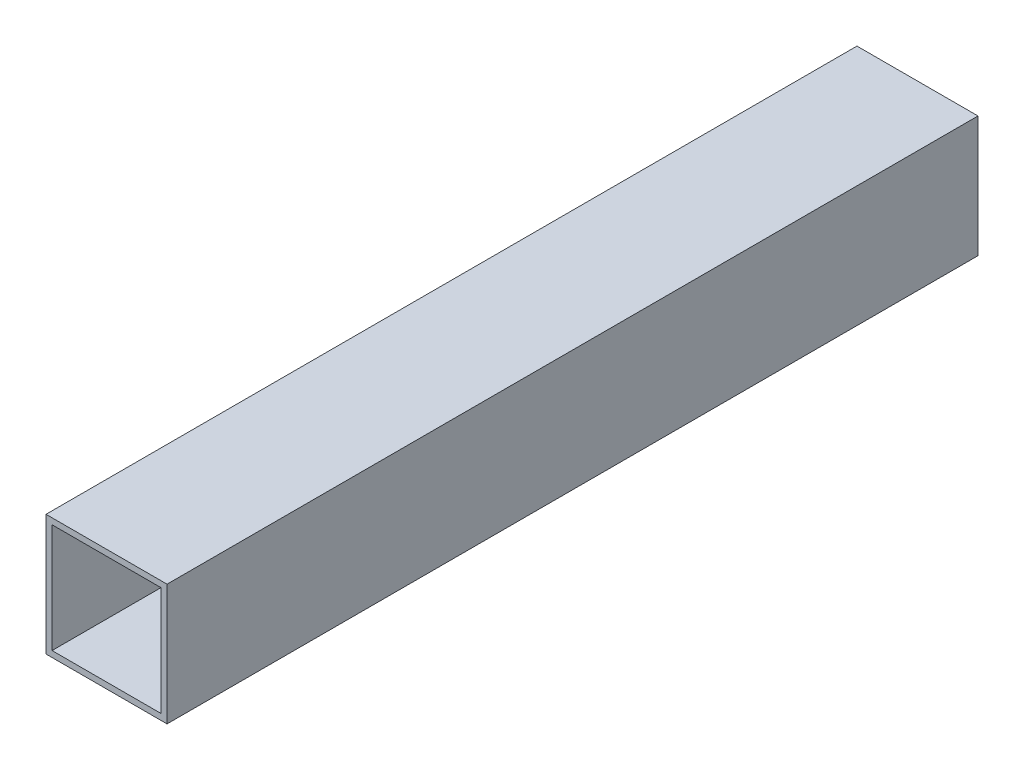
ISO-10303-21;
HEADER;
FILE_DESCRIPTION(('STEP AP214'),'2;1');
FILE_NAME('part.step','',(''),(''),'','','');
FILE_SCHEMA(('AUTOMOTIVE_DESIGN { 1 0 10303 214 1 1 1 1 }'));
ENDSEC;
DATA;
#1=APPLICATION_CONTEXT('core data for automotive mechanical design processes');
#2=APPLICATION_PROTOCOL_DEFINITION('international standard','automotive_design',2000,#1);
#3=PRODUCT_CONTEXT('',#1,'mechanical');
#4=PRODUCT('Part','Part','',(#3));
#5=PRODUCT_RELATED_PRODUCT_CATEGORY('part','',(#4));
#6=PRODUCT_DEFINITION_FORMATION('','',#4);
#7=PRODUCT_DEFINITION_CONTEXT('part definition',#1,'design');
#8=PRODUCT_DEFINITION('design','',#6,#7);
#9=PRODUCT_DEFINITION_SHAPE('','',#8);
#10=(LENGTH_UNIT() NAMED_UNIT(*) SI_UNIT(.MILLI.,.METRE.));
#11=(NAMED_UNIT(*) PLANE_ANGLE_UNIT() SI_UNIT($,.RADIAN.));
#12=(NAMED_UNIT(*) SI_UNIT($,.STERADIAN.) SOLID_ANGLE_UNIT());
#13=UNCERTAINTY_MEASURE_WITH_UNIT(LENGTH_MEASURE(1.E-05),#10,'distance_accuracy_value','');
#14=(GEOMETRIC_REPRESENTATION_CONTEXT(3) GLOBAL_UNCERTAINTY_ASSIGNED_CONTEXT((#13)) GLOBAL_UNIT_ASSIGNED_CONTEXT((#10,
#11,#12)) REPRESENTATION_CONTEXT('',''));
#15=CARTESIAN_POINT('',(0.,0.,0.));
#16=DIRECTION('',(0.,0.,1.));
#17=DIRECTION('',(1.,0.,0.));
#18=AXIS2_PLACEMENT_3D('',#15,#16,#17);
#19=CARTESIAN_POINT('',(-20.,-20.,-1368.));
#20=DIRECTION('',(0.,0.,-1.));
#21=DIRECTION('',(1.,0.,0.));
#22=AXIS2_PLACEMENT_3D('',#19,#20,#21);
#23=PLANE('',#22);
#24=DIRECTION('',(0.,-1.,0.));
#25=VECTOR('',#24,1.);
#26=CARTESIAN_POINT('',(-20.,-20.,-1368.));
#27=LINE('',#26,#25);
#28=CARTESIAN_POINT('',(-20.,20.,-1368.));
#29=VERTEX_POINT('',#28);
#30=CARTESIAN_POINT('',(-20.,-20.,-1368.));
#31=VERTEX_POINT('',#30);
#32=EDGE_CURVE('E129',#29,#31,#27,.T.);
#33=ORIENTED_EDGE('',*,*,#32,.F.);
#34=DIRECTION('',(-1.,0.,0.));
#35=VECTOR('',#34,1.);
#36=CARTESIAN_POINT('',(20.,20.,-1368.));
#37=LINE('',#36,#35);
#38=CARTESIAN_POINT('',(20.,20.,-1368.));
#39=VERTEX_POINT('',#38);
#40=EDGE_CURVE('E139',#39,#29,#37,.T.);
#41=ORIENTED_EDGE('',*,*,#40,.F.);
#42=DIRECTION('',(0.,1.,0.));
#43=VECTOR('',#42,1.);
#44=CARTESIAN_POINT('',(20.,-20.,-1368.));
#45=LINE('',#44,#43);
#46=CARTESIAN_POINT('',(20.,-20.,-1368.));
#47=VERTEX_POINT('',#46);
#48=EDGE_CURVE('E136',#47,#39,#45,.T.);
#49=ORIENTED_EDGE('',*,*,#48,.F.);
#50=DIRECTION('',(1.,0.,0.));
#51=VECTOR('',#50,1.);
#52=CARTESIAN_POINT('',(20.,-20.,-1368.));
#53=LINE('',#52,#51);
#54=EDGE_CURVE('E132',#31,#47,#53,.T.);
#55=ORIENTED_EDGE('',*,*,#54,.F.);
#56=EDGE_LOOP('',(#33,#41,#49,#55));
#57=FACE_BOUND('',#56,.T.);
#58=DIRECTION('',(1.,0.,0.));
#59=VECTOR('',#58,1.);
#60=CARTESIAN_POINT('',(20.,-18.,-1368.));
#61=LINE('',#60,#59);
#62=CARTESIAN_POINT('',(-18.,-18.,-1368.));
#63=VERTEX_POINT('',#62);
#64=CARTESIAN_POINT('',(18.,-18.,-1368.));
#65=VERTEX_POINT('',#64);
#66=EDGE_CURVE('E110',#63,#65,#61,.T.);
#67=ORIENTED_EDGE('',*,*,#66,.T.);
#68=DIRECTION('',(0.,1.,0.));
#69=VECTOR('',#68,1.);
#70=CARTESIAN_POINT('',(18.,-20.,-1368.));
#71=LINE('',#70,#69);
#72=CARTESIAN_POINT('',(18.,18.,-1368.));
#73=VERTEX_POINT('',#72);
#74=EDGE_CURVE('E115',#65,#73,#71,.T.);
#75=ORIENTED_EDGE('',*,*,#74,.T.);
#76=DIRECTION('',(-1.,0.,0.));
#77=VECTOR('',#76,1.);
#78=CARTESIAN_POINT('',(20.,18.,-1368.));
#79=LINE('',#78,#77);
#80=CARTESIAN_POINT('',(-18.,18.,-1368.));
#81=VERTEX_POINT('',#80);
#82=EDGE_CURVE('E111',#73,#81,#79,.T.);
#83=ORIENTED_EDGE('',*,*,#82,.T.);
#84=DIRECTION('',(0.,-1.,0.));
#85=VECTOR('',#84,1.);
#86=CARTESIAN_POINT('',(-18.,-20.,-1368.));
#87=LINE('',#86,#85);
#88=EDGE_CURVE('E96',#81,#63,#87,.T.);
#89=ORIENTED_EDGE('',*,*,#88,.T.);
#90=EDGE_LOOP('',(#67,#75,#83,#89));
#91=FACE_BOUND('',#90,.T.);
#92=ADVANCED_FACE('F30',(#57,#91),#23,.T.);
#93=CARTESIAN_POINT('',(-20.,-20.,-1100.));
#94=DIRECTION('',(0.,0.,-1.));
#95=DIRECTION('',(1.,0.,0.));
#96=AXIS2_PLACEMENT_3D('',#93,#94,#95);
#97=PLANE('',#96);
#98=DIRECTION('',(0.,-1.,0.));
#99=VECTOR('',#98,1.);
#100=CARTESIAN_POINT('',(-20.,-20.,-1100.));
#101=LINE('',#100,#99);
#102=CARTESIAN_POINT('',(-20.,20.,-1100.));
#103=VERTEX_POINT('',#102);
#104=CARTESIAN_POINT('',(-20.,-20.,-1100.));
#105=VERTEX_POINT('',#104);
#106=EDGE_CURVE('E104',#103,#105,#101,.T.);
#107=ORIENTED_EDGE('',*,*,#106,.T.);
#108=DIRECTION('',(1.,0.,0.));
#109=VECTOR('',#108,1.);
#110=CARTESIAN_POINT('',(20.,-20.,-1100.));
#111=LINE('',#110,#109);
#112=CARTESIAN_POINT('',(20.,-20.,-1100.));
#113=VERTEX_POINT('',#112);
#114=EDGE_CURVE('E145',#105,#113,#111,.T.);
#115=ORIENTED_EDGE('',*,*,#114,.T.);
#116=DIRECTION('',(0.,1.,0.));
#117=VECTOR('',#116,1.);
#118=CARTESIAN_POINT('',(20.,-20.,-1100.));
#119=LINE('',#118,#117);
#120=CARTESIAN_POINT('',(20.,20.,-1100.));
#121=VERTEX_POINT('',#120);
#122=EDGE_CURVE('E148',#113,#121,#119,.T.);
#123=ORIENTED_EDGE('',*,*,#122,.T.);
#124=DIRECTION('',(-1.,0.,0.));
#125=VECTOR('',#124,1.);
#126=CARTESIAN_POINT('',(20.,20.,-1100.));
#127=LINE('',#126,#125);
#128=EDGE_CURVE('E133',#121,#103,#127,.T.);
#129=ORIENTED_EDGE('',*,*,#128,.T.);
#130=EDGE_LOOP('',(#107,#115,#123,#129));
#131=FACE_BOUND('',#130,.T.);
#132=DIRECTION('',(0.,-1.,0.));
#133=VECTOR('',#132,1.);
#134=CARTESIAN_POINT('',(-18.,-20.,-1100.));
#135=LINE('',#134,#133);
#136=CARTESIAN_POINT('',(-18.,18.,-1100.));
#137=VERTEX_POINT('',#136);
#138=CARTESIAN_POINT('',(-18.,-18.,-1100.));
#139=VERTEX_POINT('',#138);
#140=EDGE_CURVE('E99',#137,#139,#135,.T.);
#141=ORIENTED_EDGE('',*,*,#140,.F.);
#142=DIRECTION('',(-1.,0.,0.));
#143=VECTOR('',#142,1.);
#144=CARTESIAN_POINT('',(20.,18.,-1100.));
#145=LINE('',#144,#143);
#146=CARTESIAN_POINT('',(18.,18.,-1100.));
#147=VERTEX_POINT('',#146);
#148=EDGE_CURVE('E112',#147,#137,#145,.T.);
#149=ORIENTED_EDGE('',*,*,#148,.F.);
#150=DIRECTION('',(0.,1.,0.));
#151=VECTOR('',#150,1.);
#152=CARTESIAN_POINT('',(18.,-20.,-1100.));
#153=LINE('',#152,#151);
#154=CARTESIAN_POINT('',(18.,-18.,-1100.));
#155=VERTEX_POINT('',#154);
#156=EDGE_CURVE('E123',#155,#147,#153,.T.);
#157=ORIENTED_EDGE('',*,*,#156,.F.);
#158=DIRECTION('',(1.,0.,0.));
#159=VECTOR('',#158,1.);
#160=CARTESIAN_POINT('',(20.,-18.,-1100.));
#161=LINE('',#160,#159);
#162=EDGE_CURVE('E121',#139,#155,#161,.T.);
#163=ORIENTED_EDGE('',*,*,#162,.F.);
#164=EDGE_LOOP('',(#141,#149,#157,#163));
#165=FACE_BOUND('',#164,.T.);
#166=ADVANCED_FACE('F165',(#131,#165),#97,.F.);
#167=CARTESIAN_POINT('',(-20.,-20.,-1368.));
#168=DIRECTION('',(1.,0.,0.));
#169=DIRECTION('',(0.,0.,1.));
#170=AXIS2_PLACEMENT_3D('',#167,#168,#169);
#171=PLANE('',#170);
#172=ORIENTED_EDGE('',*,*,#106,.F.);
#173=DIRECTION('',(0.,0.,1.));
#174=VECTOR('',#173,1.);
#175=CARTESIAN_POINT('',(-20.,20.,-1368.));
#176=LINE('',#175,#174);
#177=EDGE_CURVE('E142',#29,#103,#176,.T.);
#178=ORIENTED_EDGE('',*,*,#177,.F.);
#179=ORIENTED_EDGE('',*,*,#32,.T.);
#180=DIRECTION('',(0.,0.,1.));
#181=VECTOR('',#180,1.);
#182=CARTESIAN_POINT('',(-20.,-20.,-1368.));
#183=LINE('',#182,#181);
#184=EDGE_CURVE('E11',#31,#105,#183,.T.);
#185=ORIENTED_EDGE('',*,*,#184,.T.);
#186=EDGE_LOOP('',(#172,#178,#179,#185));
#187=FACE_BOUND('',#186,.T.);
#188=ADVANCED_FACE('F32',(#187),#171,.F.);
#189=CARTESIAN_POINT('',(20.,-20.,-1368.));
#190=DIRECTION('',(0.,1.,0.));
#191=DIRECTION('',(-1.,0.,0.));
#192=AXIS2_PLACEMENT_3D('',#189,#190,#191);
#193=PLANE('',#192);
#194=ORIENTED_EDGE('',*,*,#114,.F.);
#195=ORIENTED_EDGE('',*,*,#184,.F.);
#196=ORIENTED_EDGE('',*,*,#54,.T.);
#197=DIRECTION('',(0.,0.,1.));
#198=VECTOR('',#197,1.);
#199=CARTESIAN_POINT('',(20.,-20.,-1368.));
#200=LINE('',#199,#198);
#201=EDGE_CURVE('E38',#47,#113,#200,.T.);
#202=ORIENTED_EDGE('',*,*,#201,.T.);
#203=EDGE_LOOP('',(#194,#195,#196,#202));
#204=FACE_BOUND('',#203,.T.);
#205=ADVANCED_FACE('F158',(#204),#193,.F.);
#206=CARTESIAN_POINT('',(20.,-20.,-1368.));
#207=DIRECTION('',(-1.,0.,0.));
#208=DIRECTION('',(0.,0.,-1.));
#209=AXIS2_PLACEMENT_3D('',#206,#207,#208);
#210=PLANE('',#209);
#211=ORIENTED_EDGE('',*,*,#122,.F.);
#212=ORIENTED_EDGE('',*,*,#201,.F.);
#213=ORIENTED_EDGE('',*,*,#48,.T.);
#214=DIRECTION('',(0.,0.,1.));
#215=VECTOR('',#214,1.);
#216=CARTESIAN_POINT('',(20.,20.,-1368.));
#217=LINE('',#216,#215);
#218=EDGE_CURVE('E154',#39,#121,#217,.T.);
#219=ORIENTED_EDGE('',*,*,#218,.T.);
#220=EDGE_LOOP('',(#211,#212,#213,#219));
#221=FACE_BOUND('',#220,.T.);
#222=ADVANCED_FACE('F162',(#221),#210,.F.);
#223=CARTESIAN_POINT('',(20.,20.,-1368.));
#224=DIRECTION('',(0.,-1.,0.));
#225=DIRECTION('',(1.,0.,0.));
#226=AXIS2_PLACEMENT_3D('',#223,#224,#225);
#227=PLANE('',#226);
#228=ORIENTED_EDGE('',*,*,#128,.F.);
#229=ORIENTED_EDGE('',*,*,#218,.F.);
#230=ORIENTED_EDGE('',*,*,#40,.T.);
#231=ORIENTED_EDGE('',*,*,#177,.T.);
#232=EDGE_LOOP('',(#228,#229,#230,#231));
#233=FACE_BOUND('',#232,.T.);
#234=ADVANCED_FACE('F173',(#233),#227,.F.);
#235=CARTESIAN_POINT('',(-18.,-20.,-1368.));
#236=DIRECTION('',(1.,0.,0.));
#237=DIRECTION('',(0.,0.,1.));
#238=AXIS2_PLACEMENT_3D('',#235,#236,#237);
#239=PLANE('',#238);
#240=ORIENTED_EDGE('',*,*,#140,.T.);
#241=DIRECTION('',(0.,0.,1.));
#242=VECTOR('',#241,1.);
#243=CARTESIAN_POINT('',(-18.,-18.,-1368.));
#244=LINE('',#243,#242);
#245=EDGE_CURVE('E93',#63,#139,#244,.T.);
#246=ORIENTED_EDGE('',*,*,#245,.F.);
#247=ORIENTED_EDGE('',*,*,#88,.F.);
#248=DIRECTION('',(0.,0.,1.));
#249=VECTOR('',#248,1.);
#250=CARTESIAN_POINT('',(-18.,18.,-1368.));
#251=LINE('',#250,#249);
#252=EDGE_CURVE('E53',#81,#137,#251,.T.);
#253=ORIENTED_EDGE('',*,*,#252,.T.);
#254=EDGE_LOOP('',(#240,#246,#247,#253));
#255=FACE_BOUND('',#254,.T.);
#256=ADVANCED_FACE('F95',(#255),#239,.T.);
#257=CARTESIAN_POINT('',(20.,-18.,-1368.));
#258=DIRECTION('',(0.,1.,0.));
#259=DIRECTION('',(-1.,0.,0.));
#260=AXIS2_PLACEMENT_3D('',#257,#258,#259);
#261=PLANE('',#260);
#262=ORIENTED_EDGE('',*,*,#162,.T.);
#263=DIRECTION('',(0.,0.,1.));
#264=VECTOR('',#263,1.);
#265=CARTESIAN_POINT('',(18.,-18.,-1368.));
#266=LINE('',#265,#264);
#267=EDGE_CURVE('E105',#65,#155,#266,.T.);
#268=ORIENTED_EDGE('',*,*,#267,.F.);
#269=ORIENTED_EDGE('',*,*,#66,.F.);
#270=ORIENTED_EDGE('',*,*,#245,.T.);
#271=EDGE_LOOP('',(#262,#268,#269,#270));
#272=FACE_BOUND('',#271,.T.);
#273=ADVANCED_FACE('F114',(#272),#261,.T.);
#274=CARTESIAN_POINT('',(18.,-20.,-1368.));
#275=DIRECTION('',(-1.,0.,0.));
#276=DIRECTION('',(0.,0.,-1.));
#277=AXIS2_PLACEMENT_3D('',#274,#275,#276);
#278=PLANE('',#277);
#279=ORIENTED_EDGE('',*,*,#156,.T.);
#280=DIRECTION('',(0.,0.,1.));
#281=VECTOR('',#280,1.);
#282=CARTESIAN_POINT('',(18.,18.,-1368.));
#283=LINE('',#282,#281);
#284=EDGE_CURVE('E45',#73,#147,#283,.T.);
#285=ORIENTED_EDGE('',*,*,#284,.F.);
#286=ORIENTED_EDGE('',*,*,#74,.F.);
#287=ORIENTED_EDGE('',*,*,#267,.T.);
#288=EDGE_LOOP('',(#279,#285,#286,#287));
#289=FACE_BOUND('',#288,.T.);
#290=ADVANCED_FACE('F191',(#289),#278,.T.);
#291=CARTESIAN_POINT('',(20.,18.,-1368.));
#292=DIRECTION('',(0.,-1.,0.));
#293=DIRECTION('',(1.,0.,0.));
#294=AXIS2_PLACEMENT_3D('',#291,#292,#293);
#295=PLANE('',#294);
#296=ORIENTED_EDGE('',*,*,#148,.T.);
#297=ORIENTED_EDGE('',*,*,#252,.F.);
#298=ORIENTED_EDGE('',*,*,#82,.F.);
#299=ORIENTED_EDGE('',*,*,#284,.T.);
#300=EDGE_LOOP('',(#296,#297,#298,#299));
#301=FACE_BOUND('',#300,.T.);
#302=ADVANCED_FACE('F194',(#301),#295,.T.);
#303=CLOSED_SHELL('',(#92,#166,#188,#205,#222,#234,#256,#273,#290,#302));
#304=MANIFOLD_SOLID_BREP('B2',#303);
#305=ADVANCED_BREP_SHAPE_REPRESENTATION('',(#18,#304),#14);
#306=SHAPE_DEFINITION_REPRESENTATION(#9,#305);
ENDSEC;
END-ISO-10303-21;
